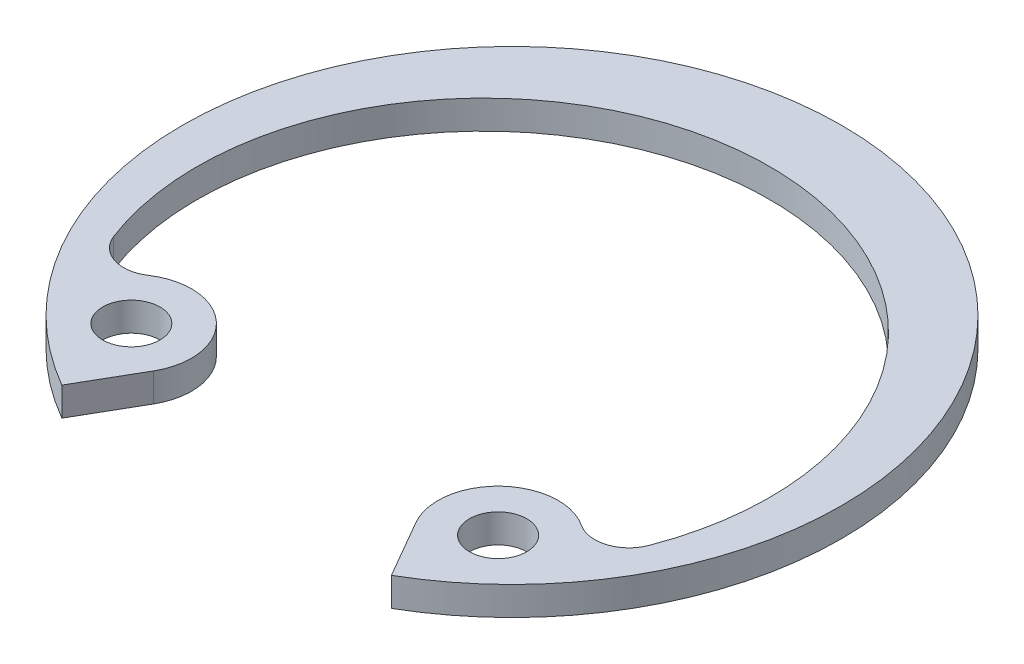
ISO-10303-21;
HEADER;
FILE_DESCRIPTION(('STEP AP214'),'2;1');
FILE_NAME('part.step','',(''),(''),'','','');
FILE_SCHEMA(('AUTOMOTIVE_DESIGN { 1 0 10303 214 1 1 1 1 }'));
ENDSEC;
DATA;
#1=APPLICATION_CONTEXT('core data for automotive mechanical design processes');
#2=APPLICATION_PROTOCOL_DEFINITION('international standard','automotive_design',2000,#1);
#3=PRODUCT_CONTEXT('',#1,'mechanical');
#4=PRODUCT('Part','Part','',(#3));
#5=PRODUCT_RELATED_PRODUCT_CATEGORY('part','',(#4));
#6=PRODUCT_DEFINITION_FORMATION('','',#4);
#7=PRODUCT_DEFINITION_CONTEXT('part definition',#1,'design');
#8=PRODUCT_DEFINITION('design','',#6,#7);
#9=PRODUCT_DEFINITION_SHAPE('','',#8);
#10=(LENGTH_UNIT() NAMED_UNIT(*) SI_UNIT(.MILLI.,.METRE.));
#11=(NAMED_UNIT(*) PLANE_ANGLE_UNIT() SI_UNIT($,.RADIAN.));
#12=(NAMED_UNIT(*) SI_UNIT($,.STERADIAN.) SOLID_ANGLE_UNIT());
#13=UNCERTAINTY_MEASURE_WITH_UNIT(LENGTH_MEASURE(1.E-05),#10,'distance_accuracy_value','');
#14=(GEOMETRIC_REPRESENTATION_CONTEXT(3) GLOBAL_UNCERTAINTY_ASSIGNED_CONTEXT((#13)) GLOBAL_UNIT_ASSIGNED_CONTEXT((#10,
#11,#12)) REPRESENTATION_CONTEXT('',''));
#15=CARTESIAN_POINT('',(0.,0.,0.));
#16=DIRECTION('',(0.,0.,1.));
#17=DIRECTION('',(1.,0.,0.));
#18=AXIS2_PLACEMENT_3D('',#15,#16,#17);
#19=CARTESIAN_POINT('',(0.,1.,0.));
#20=DIRECTION('',(0.,1.,0.));
#21=DIRECTION('',(0.,0.,1.));
#22=AXIS2_PLACEMENT_3D('',#19,#20,#21);
#23=PLANE('',#22);
#24=CARTESIAN_POINT('',(6.39986497807312,1.,6.88489130360336));
#25=DIRECTION('',(0.,1.,0.));
#26=DIRECTION('',(0.,0.,1.));
#27=AXIS2_PLACEMENT_3D('',#24,#25,#26);
#28=CIRCLE('',#27,1.);
#29=CARTESIAN_POINT('',(6.39986497807312,1.,7.88489130360336));
#30=VERTEX_POINT('',#29);
#31=EDGE_CURVE('E146',#30,#30,#28,.T.);
#32=ORIENTED_EDGE('',*,*,#31,.F.);
#33=EDGE_LOOP('',(#32));
#34=FACE_BOUND('',#33,.T.);
#35=CARTESIAN_POINT('',(0.,1.,0.));
#36=DIRECTION('',(0.,1.,0.));
#37=DIRECTION('',(0.,0.,1.));
#38=AXIS2_PLACEMENT_3D('',#35,#36,#37);
#39=CIRCLE('',#38,11.5);
#40=CARTESIAN_POINT('',(5.74999999999998,1.,9.95929214352106));
#41=VERTEX_POINT('',#40);
#42=CARTESIAN_POINT('',(-5.74999999999998,1.,9.95929214352106));
#43=VERTEX_POINT('',#42);
#44=EDGE_CURVE('E164',#41,#43,#39,.T.);
#45=ORIENTED_EDGE('',*,*,#44,.T.);
#46=DIRECTION('',(0.499999999999998,0.,-0.866025403784439));
#47=VECTOR('',#46,1.);
#48=CARTESIAN_POINT('',(-5.74999999999998,1.,9.95929214352106));
#49=LINE('',#48,#47);
#50=CARTESIAN_POINT('',(-4.58121163012579,1.,7.93489130360336));
#51=VERTEX_POINT('',#50);
#52=EDGE_CURVE('E100',#43,#51,#49,.T.);
#53=ORIENTED_EDGE('',*,*,#52,.T.);
#54=CARTESIAN_POINT('',(-6.39986497807312,1.,6.88489130360336));
#55=DIRECTION('',(0.,1.,0.));
#56=DIRECTION('',(0.,0.,1.));
#57=AXIS2_PLACEMENT_3D('',#54,#55,#56);
#58=CIRCLE('',#57,2.1);
#59=CARTESIAN_POINT('',(-7.55802294699711,1.,5.13312929950068));
#60=VERTEX_POINT('',#59);
#61=EDGE_CURVE('E185',#51,#60,#58,.T.);
#62=ORIENTED_EDGE('',*,*,#61,.T.);
#63=CARTESIAN_POINT('',(-8.21982750066797,1.,4.13212244001344));
#64=DIRECTION('',(0.,-1.,0.));
#65=DIRECTION('',(0.,0.,-1.));
#66=AXIS2_PLACEMENT_3D('',#63,#64,#65);
#67=CIRCLE('',#66,1.20000000000002);
#68=CARTESIAN_POINT('',(-9.34105607540988,1.,4.55972796287567));
#69=VERTEX_POINT('',#68);
#70=EDGE_CURVE('E199',#60,#69,#67,.T.);
#71=ORIENTED_EDGE('',*,*,#70,.T.);
#72=CARTESIAN_POINT('',(0.,1.,0.99730790224666));
#73=DIRECTION('',(0.,-1.,0.));
#74=DIRECTION('',(0.,0.,-1.));
#75=AXIS2_PLACEMENT_3D('',#72,#73,#74);
#76=CIRCLE('',#75,9.99730790224669);
#77=CARTESIAN_POINT('',(9.3410560754099,1.,4.55972796287567));
#78=VERTEX_POINT('',#77);
#79=EDGE_CURVE('E119',#69,#78,#76,.T.);
#80=ORIENTED_EDGE('',*,*,#79,.T.);
#81=CARTESIAN_POINT('',(8.21982750066798,1.,4.13212244001343));
#82=DIRECTION('',(0.,-1.,0.));
#83=DIRECTION('',(0.,0.,-1.));
#84=AXIS2_PLACEMENT_3D('',#81,#82,#83);
#85=CIRCLE('',#84,1.20000000000002);
#86=CARTESIAN_POINT('',(7.55802294699711,1.,5.1331292995007));
#87=VERTEX_POINT('',#86);
#88=EDGE_CURVE('E113',#78,#87,#85,.T.);
#89=ORIENTED_EDGE('',*,*,#88,.T.);
#90=CARTESIAN_POINT('',(6.39986497807312,1.,6.88489130360336));
#91=DIRECTION('',(0.,1.,0.));
#92=DIRECTION('',(0.,0.,1.));
#93=AXIS2_PLACEMENT_3D('',#90,#91,#92);
#94=CIRCLE('',#93,2.1);
#95=CARTESIAN_POINT('',(4.5812116301258,1.,7.93489130360336));
#96=VERTEX_POINT('',#95);
#97=EDGE_CURVE('E117',#87,#96,#94,.T.);
#98=ORIENTED_EDGE('',*,*,#97,.T.);
#99=DIRECTION('',(0.499999999999998,0.,0.86602540378444));
#100=VECTOR('',#99,1.);
#101=CARTESIAN_POINT('',(4.5812116301258,1.,7.93489130360336));
#102=LINE('',#101,#100);
#103=EDGE_CURVE('E57',#96,#41,#102,.T.);
#104=ORIENTED_EDGE('',*,*,#103,.T.);
#105=EDGE_LOOP('',(#45,#53,#62,#71,#80,#89,#98,#104));
#106=FACE_BOUND('',#105,.T.);
#107=CARTESIAN_POINT('',(-6.39986497807312,1.,6.88489130360336));
#108=DIRECTION('',(0.,1.,0.));
#109=DIRECTION('',(0.,0.,1.));
#110=AXIS2_PLACEMENT_3D('',#107,#108,#109);
#111=CIRCLE('',#110,1.);
#112=CARTESIAN_POINT('',(-6.39986497807312,1.,7.88489130360336));
#113=VERTEX_POINT('',#112);
#114=EDGE_CURVE('E213',#113,#113,#111,.T.);
#115=ORIENTED_EDGE('',*,*,#114,.F.);
#116=EDGE_LOOP('',(#115));
#117=FACE_BOUND('',#116,.T.);
#118=ADVANCED_FACE('F39',(#34,#106,#117),#23,.T.);
#119=CARTESIAN_POINT('',(0.,0.,0.));
#120=DIRECTION('',(0.,1.,0.));
#121=DIRECTION('',(0.,0.,1.));
#122=AXIS2_PLACEMENT_3D('',#119,#120,#121);
#123=PLANE('',#122);
#124=CARTESIAN_POINT('',(0.,0.,0.));
#125=DIRECTION('',(0.,1.,0.));
#126=DIRECTION('',(0.,0.,1.));
#127=AXIS2_PLACEMENT_3D('',#124,#125,#126);
#128=CIRCLE('',#127,11.5);
#129=CARTESIAN_POINT('',(5.74999999999998,0.,9.95929214352106));
#130=VERTEX_POINT('',#129);
#131=CARTESIAN_POINT('',(-5.74999999999998,0.,9.95929214352106));
#132=VERTEX_POINT('',#131);
#133=EDGE_CURVE('E141',#130,#132,#128,.T.);
#134=ORIENTED_EDGE('',*,*,#133,.F.);
#135=DIRECTION('',(0.499999999999998,0.,0.86602540378444));
#136=VECTOR('',#135,1.);
#137=CARTESIAN_POINT('',(4.5812116301258,0.,7.93489130360336));
#138=LINE('',#137,#136);
#139=CARTESIAN_POINT('',(4.5812116301258,0.,7.93489130360336));
#140=VERTEX_POINT('',#139);
#141=EDGE_CURVE('E92',#140,#130,#138,.T.);
#142=ORIENTED_EDGE('',*,*,#141,.F.);
#143=CARTESIAN_POINT('',(6.39986497807312,0.,6.88489130360336));
#144=DIRECTION('',(0.,1.,0.));
#145=DIRECTION('',(0.,0.,1.));
#146=AXIS2_PLACEMENT_3D('',#143,#144,#145);
#147=CIRCLE('',#146,2.1);
#148=CARTESIAN_POINT('',(7.55802294699711,0.,5.1331292995007));
#149=VERTEX_POINT('',#148);
#150=EDGE_CURVE('E86',#149,#140,#147,.T.);
#151=ORIENTED_EDGE('',*,*,#150,.F.);
#152=CARTESIAN_POINT('',(8.21982750066798,0.,4.13212244001343));
#153=DIRECTION('',(0.,-1.,0.));
#154=DIRECTION('',(0.,0.,-1.));
#155=AXIS2_PLACEMENT_3D('',#152,#153,#154);
#156=CIRCLE('',#155,1.20000000000002);
#157=CARTESIAN_POINT('',(9.3410560754099,0.,4.55972796287567));
#158=VERTEX_POINT('',#157);
#159=EDGE_CURVE('E128',#158,#149,#156,.T.);
#160=ORIENTED_EDGE('',*,*,#159,.F.);
#161=CARTESIAN_POINT('',(0.,0.,0.99730790224666));
#162=DIRECTION('',(0.,-1.,0.));
#163=DIRECTION('',(0.,0.,-1.));
#164=AXIS2_PLACEMENT_3D('',#161,#162,#163);
#165=CIRCLE('',#164,9.99730790224669);
#166=CARTESIAN_POINT('',(-9.34105607540988,0.,4.55972796287567));
#167=VERTEX_POINT('',#166);
#168=EDGE_CURVE('E155',#167,#158,#165,.T.);
#169=ORIENTED_EDGE('',*,*,#168,.F.);
#170=CARTESIAN_POINT('',(-8.21982750066797,0.,4.13212244001344));
#171=DIRECTION('',(0.,-1.,0.));
#172=DIRECTION('',(0.,0.,-1.));
#173=AXIS2_PLACEMENT_3D('',#170,#171,#172);
#174=CIRCLE('',#173,1.20000000000002);
#175=CARTESIAN_POINT('',(-7.55802294699711,0.,5.13312929950068));
#176=VERTEX_POINT('',#175);
#177=EDGE_CURVE('E152',#176,#167,#174,.T.);
#178=ORIENTED_EDGE('',*,*,#177,.F.);
#179=CARTESIAN_POINT('',(-6.39986497807312,0.,6.88489130360336));
#180=DIRECTION('',(0.,1.,0.));
#181=DIRECTION('',(0.,0.,1.));
#182=AXIS2_PLACEMENT_3D('',#179,#180,#181);
#183=CIRCLE('',#182,2.1);
#184=CARTESIAN_POINT('',(-4.58121163012579,0.,7.93489130360336));
#185=VERTEX_POINT('',#184);
#186=EDGE_CURVE('E149',#185,#176,#183,.T.);
#187=ORIENTED_EDGE('',*,*,#186,.F.);
#188=DIRECTION('',(0.499999999999998,0.,-0.866025403784439));
#189=VECTOR('',#188,1.);
#190=CARTESIAN_POINT('',(-5.74999999999998,0.,9.95929214352106));
#191=LINE('',#190,#189);
#192=EDGE_CURVE('E145',#132,#185,#191,.T.);
#193=ORIENTED_EDGE('',*,*,#192,.F.);
#194=EDGE_LOOP('',(#134,#142,#151,#160,#169,#178,#187,#193));
#195=FACE_BOUND('',#194,.T.);
#196=CARTESIAN_POINT('',(6.39986497807312,0.,6.88489130360336));
#197=DIRECTION('',(0.,1.,0.));
#198=DIRECTION('',(0.,0.,1.));
#199=AXIS2_PLACEMENT_3D('',#196,#197,#198);
#200=CIRCLE('',#199,1.);
#201=CARTESIAN_POINT('',(6.39986497807312,0.,7.88489130360336));
#202=VERTEX_POINT('',#201);
#203=EDGE_CURVE('E209',#202,#202,#200,.T.);
#204=ORIENTED_EDGE('',*,*,#203,.T.);
#205=EDGE_LOOP('',(#204));
#206=FACE_BOUND('',#205,.T.);
#207=CARTESIAN_POINT('',(-6.39986497807312,0.,6.88489130360336));
#208=DIRECTION('',(0.,1.,0.));
#209=DIRECTION('',(0.,0.,1.));
#210=AXIS2_PLACEMENT_3D('',#207,#208,#209);
#211=CIRCLE('',#210,1.);
#212=CARTESIAN_POINT('',(-6.39986497807312,0.,7.88489130360336));
#213=VERTEX_POINT('',#212);
#214=EDGE_CURVE('E217',#213,#213,#211,.T.);
#215=ORIENTED_EDGE('',*,*,#214,.T.);
#216=EDGE_LOOP('',(#215));
#217=FACE_BOUND('',#216,.T.);
#218=ADVANCED_FACE('F189',(#195,#206,#217),#123,.F.);
#219=CARTESIAN_POINT('',(0.,1.,0.));
#220=DIRECTION('',(0.,-1.,0.));
#221=DIRECTION('',(0.,0.,-1.));
#222=AXIS2_PLACEMENT_3D('',#219,#220,#221);
#223=CYLINDRICAL_SURFACE('',#222,11.5);
#224=ORIENTED_EDGE('',*,*,#133,.T.);
#225=DIRECTION('',(0.,-1.,0.));
#226=VECTOR('',#225,1.);
#227=CARTESIAN_POINT('',(-5.74999999999998,1.,9.95929214352106));
#228=LINE('',#227,#226);
#229=EDGE_CURVE('E11',#43,#132,#228,.T.);
#230=ORIENTED_EDGE('',*,*,#229,.F.);
#231=ORIENTED_EDGE('',*,*,#44,.F.);
#232=DIRECTION('',(0.,-1.,0.));
#233=VECTOR('',#232,1.);
#234=CARTESIAN_POINT('',(5.74999999999998,1.,9.95929214352106));
#235=LINE('',#234,#233);
#236=EDGE_CURVE('E137',#41,#130,#235,.T.);
#237=ORIENTED_EDGE('',*,*,#236,.T.);
#238=EDGE_LOOP('',(#224,#230,#231,#237));
#239=FACE_BOUND('',#238,.T.);
#240=ADVANCED_FACE('F41',(#239),#223,.T.);
#241=CARTESIAN_POINT('',(-5.74999999999998,1.,9.95929214352106));
#242=DIRECTION('',(-0.86602540378444,0.,-0.499999999999999));
#243=DIRECTION('',(-0.499999999999998,0.,0.866025403784439));
#244=AXIS2_PLACEMENT_3D('',#241,#242,#243);
#245=PLANE('',#244);
#246=ORIENTED_EDGE('',*,*,#192,.T.);
#247=DIRECTION('',(0.,-1.,0.));
#248=VECTOR('',#247,1.);
#249=CARTESIAN_POINT('',(-4.58121163012579,1.,7.93489130360336));
#250=LINE('',#249,#248);
#251=EDGE_CURVE('E49',#51,#185,#250,.T.);
#252=ORIENTED_EDGE('',*,*,#251,.F.);
#253=ORIENTED_EDGE('',*,*,#52,.F.);
#254=ORIENTED_EDGE('',*,*,#229,.T.);
#255=EDGE_LOOP('',(#246,#252,#253,#254));
#256=FACE_BOUND('',#255,.T.);
#257=ADVANCED_FACE('F251',(#256),#245,.F.);
#258=CARTESIAN_POINT('',(-6.39986497807312,1.,6.88489130360336));
#259=DIRECTION('',(0.,-1.,0.));
#260=DIRECTION('',(0.,0.,-1.));
#261=AXIS2_PLACEMENT_3D('',#258,#259,#260);
#262=CYLINDRICAL_SURFACE('',#261,2.1);
#263=ORIENTED_EDGE('',*,*,#186,.T.);
#264=DIRECTION('',(0.,-1.,0.));
#265=VECTOR('',#264,1.);
#266=CARTESIAN_POINT('',(-7.55802294699711,1.,5.13312929950068));
#267=LINE('',#266,#265);
#268=EDGE_CURVE('E175',#60,#176,#267,.T.);
#269=ORIENTED_EDGE('',*,*,#268,.F.);
#270=ORIENTED_EDGE('',*,*,#61,.F.);
#271=ORIENTED_EDGE('',*,*,#251,.T.);
#272=EDGE_LOOP('',(#263,#269,#270,#271));
#273=FACE_BOUND('',#272,.T.);
#274=ADVANCED_FACE('F183',(#273),#262,.T.);
#275=CARTESIAN_POINT('',(-8.21982750066797,1.,4.13212244001344));
#276=DIRECTION('',(0.,-1.,0.));
#277=DIRECTION('',(0.,0.,-1.));
#278=AXIS2_PLACEMENT_3D('',#275,#276,#277);
#279=CYLINDRICAL_SURFACE('',#278,1.20000000000002);
#280=ORIENTED_EDGE('',*,*,#177,.T.);
#281=DIRECTION('',(0.,-1.,0.));
#282=VECTOR('',#281,1.);
#283=CARTESIAN_POINT('',(-9.34105607540988,1.,4.55972796287567));
#284=LINE('',#283,#282);
#285=EDGE_CURVE('E171',#69,#167,#284,.T.);
#286=ORIENTED_EDGE('',*,*,#285,.F.);
#287=ORIENTED_EDGE('',*,*,#70,.F.);
#288=ORIENTED_EDGE('',*,*,#268,.T.);
#289=EDGE_LOOP('',(#280,#286,#287,#288));
#290=FACE_BOUND('',#289,.T.);
#291=ADVANCED_FACE('F194',(#290),#279,.F.);
#292=CARTESIAN_POINT('',(0.,1.,0.99730790224666));
#293=DIRECTION('',(0.,-1.,0.));
#294=DIRECTION('',(0.,0.,-1.));
#295=AXIS2_PLACEMENT_3D('',#292,#293,#294);
#296=CYLINDRICAL_SURFACE('',#295,9.99730790224669);
#297=ORIENTED_EDGE('',*,*,#168,.T.);
#298=DIRECTION('',(0.,-1.,0.));
#299=VECTOR('',#298,1.);
#300=CARTESIAN_POINT('',(9.3410560754099,1.,4.55972796287567));
#301=LINE('',#300,#299);
#302=EDGE_CURVE('E130',#78,#158,#301,.T.);
#303=ORIENTED_EDGE('',*,*,#302,.F.);
#304=ORIENTED_EDGE('',*,*,#79,.F.);
#305=ORIENTED_EDGE('',*,*,#285,.T.);
#306=EDGE_LOOP('',(#297,#303,#304,#305));
#307=FACE_BOUND('',#306,.T.);
#308=ADVANCED_FACE('F197',(#307),#296,.F.);
#309=CARTESIAN_POINT('',(8.21982750066798,1.,4.13212244001343));
#310=DIRECTION('',(0.,-1.,0.));
#311=DIRECTION('',(0.,0.,-1.));
#312=AXIS2_PLACEMENT_3D('',#309,#310,#311);
#313=CYLINDRICAL_SURFACE('',#312,1.20000000000002);
#314=ORIENTED_EDGE('',*,*,#159,.T.);
#315=DIRECTION('',(0.,-1.,0.));
#316=VECTOR('',#315,1.);
#317=CARTESIAN_POINT('',(7.55802294699711,1.,5.1331292995007));
#318=LINE('',#317,#316);
#319=EDGE_CURVE('E125',#87,#149,#318,.T.);
#320=ORIENTED_EDGE('',*,*,#319,.F.);
#321=ORIENTED_EDGE('',*,*,#88,.F.);
#322=ORIENTED_EDGE('',*,*,#302,.T.);
#323=EDGE_LOOP('',(#314,#320,#321,#322));
#324=FACE_BOUND('',#323,.T.);
#325=ADVANCED_FACE('F126',(#324),#313,.F.);
#326=CARTESIAN_POINT('',(6.39986497807312,1.,6.88489130360336));
#327=DIRECTION('',(0.,-1.,0.));
#328=DIRECTION('',(0.,0.,-1.));
#329=AXIS2_PLACEMENT_3D('',#326,#327,#328);
#330=CYLINDRICAL_SURFACE('',#329,2.1);
#331=ORIENTED_EDGE('',*,*,#150,.T.);
#332=DIRECTION('',(0.,-1.,0.));
#333=VECTOR('',#332,1.);
#334=CARTESIAN_POINT('',(4.5812116301258,1.,7.93489130360336));
#335=LINE('',#334,#333);
#336=EDGE_CURVE('E131',#96,#140,#335,.T.);
#337=ORIENTED_EDGE('',*,*,#336,.F.);
#338=ORIENTED_EDGE('',*,*,#97,.F.);
#339=ORIENTED_EDGE('',*,*,#319,.T.);
#340=EDGE_LOOP('',(#331,#337,#338,#339));
#341=FACE_BOUND('',#340,.T.);
#342=ADVANCED_FACE('F133',(#341),#330,.T.);
#343=CARTESIAN_POINT('',(4.5812116301258,1.,7.93489130360336));
#344=DIRECTION('',(0.86602540378444,0.,-0.499999999999998));
#345=DIRECTION('',(-0.499999999999998,0.,-0.86602540378444));
#346=AXIS2_PLACEMENT_3D('',#343,#344,#345);
#347=PLANE('',#346);
#348=ORIENTED_EDGE('',*,*,#141,.T.);
#349=ORIENTED_EDGE('',*,*,#236,.F.);
#350=ORIENTED_EDGE('',*,*,#103,.F.);
#351=ORIENTED_EDGE('',*,*,#336,.T.);
#352=EDGE_LOOP('',(#348,#349,#350,#351));
#353=FACE_BOUND('',#352,.T.);
#354=ADVANCED_FACE('F239',(#353),#347,.F.);
#355=CARTESIAN_POINT('',(6.39986497807312,1.,6.88489130360336));
#356=DIRECTION('',(0.,-1.,0.));
#357=DIRECTION('',(0.,0.,-1.));
#358=AXIS2_PLACEMENT_3D('',#355,#356,#357);
#359=CYLINDRICAL_SURFACE('',#358,1.);
#360=ORIENTED_EDGE('',*,*,#31,.T.);
#361=EDGE_LOOP('',(#360));
#362=FACE_BOUND('',#361,.T.);
#363=ORIENTED_EDGE('',*,*,#203,.F.);
#364=EDGE_LOOP('',(#363));
#365=FACE_BOUND('',#364,.T.);
#366=ADVANCED_FACE('F236',(#362,#365),#359,.F.);
#367=CARTESIAN_POINT('',(-6.39986497807312,1.,6.88489130360336));
#368=DIRECTION('',(0.,-1.,0.));
#369=DIRECTION('',(0.,0.,-1.));
#370=AXIS2_PLACEMENT_3D('',#367,#368,#369);
#371=CYLINDRICAL_SURFACE('',#370,1.);
#372=ORIENTED_EDGE('',*,*,#114,.T.);
#373=EDGE_LOOP('',(#372));
#374=FACE_BOUND('',#373,.T.);
#375=ORIENTED_EDGE('',*,*,#214,.F.);
#376=EDGE_LOOP('',(#375));
#377=FACE_BOUND('',#376,.T.);
#378=ADVANCED_FACE('F225',(#374,#377),#371,.F.);
#379=CLOSED_SHELL('',(#118,#218,#240,#257,#274,#291,#308,#325,#342,#354,#366,#378));
#380=MANIFOLD_SOLID_BREP('B2',#379);
#381=ADVANCED_BREP_SHAPE_REPRESENTATION('',(#18,#380),#14);
#382=SHAPE_DEFINITION_REPRESENTATION(#9,#381);
ENDSEC;
END-ISO-10303-21;
